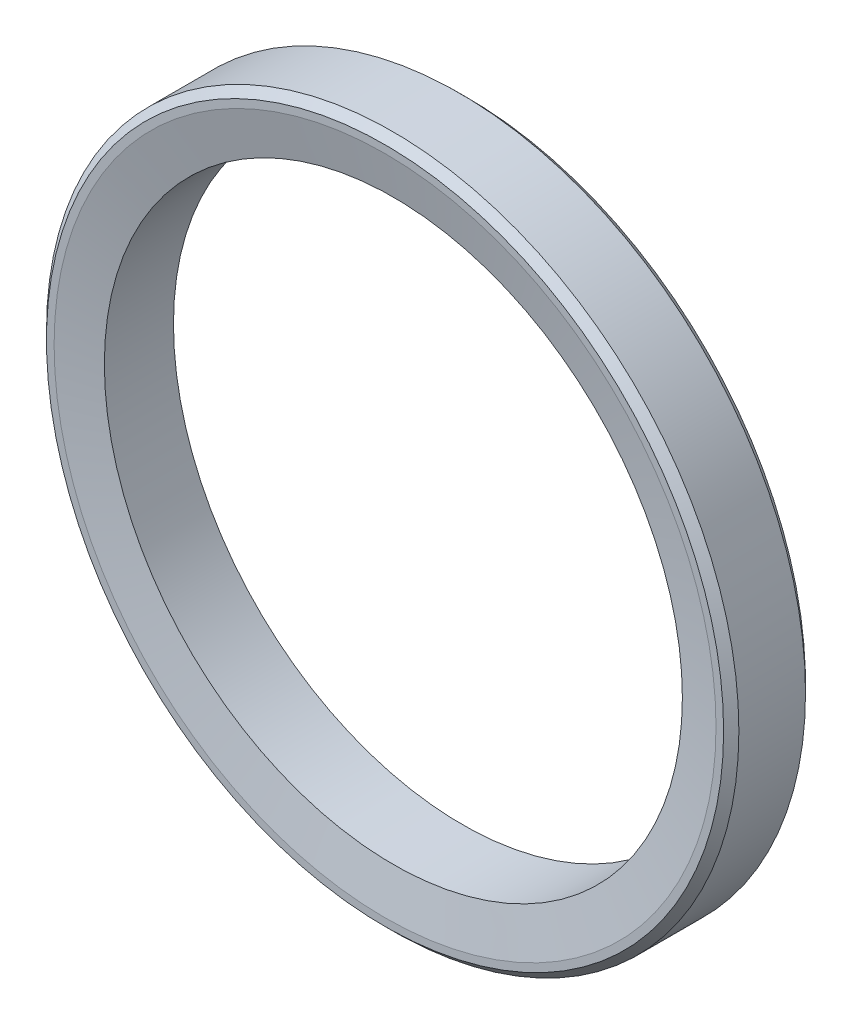
ISO-10303-21;
HEADER;
FILE_DESCRIPTION(('STEP AP214'),'2;1');
FILE_NAME('part.step','',(''),(''),'','','');
FILE_SCHEMA(('AUTOMOTIVE_DESIGN { 1 0 10303 214 1 1 1 1 }'));
ENDSEC;
DATA;
#1=APPLICATION_CONTEXT('core data for automotive mechanical design processes');
#2=APPLICATION_PROTOCOL_DEFINITION('international standard','automotive_design',2000,#1);
#3=PRODUCT_CONTEXT('',#1,'mechanical');
#4=PRODUCT('Part','Part','',(#3));
#5=PRODUCT_RELATED_PRODUCT_CATEGORY('part','',(#4));
#6=PRODUCT_DEFINITION_FORMATION('','',#4);
#7=PRODUCT_DEFINITION_CONTEXT('part definition',#1,'design');
#8=PRODUCT_DEFINITION('design','',#6,#7);
#9=PRODUCT_DEFINITION_SHAPE('','',#8);
#10=(LENGTH_UNIT() NAMED_UNIT(*) SI_UNIT(.MILLI.,.METRE.));
#11=(NAMED_UNIT(*) PLANE_ANGLE_UNIT() SI_UNIT($,.RADIAN.));
#12=(NAMED_UNIT(*) SI_UNIT($,.STERADIAN.) SOLID_ANGLE_UNIT());
#13=UNCERTAINTY_MEASURE_WITH_UNIT(LENGTH_MEASURE(1.E-05),#10,'distance_accuracy_value','');
#14=(GEOMETRIC_REPRESENTATION_CONTEXT(3) GLOBAL_UNCERTAINTY_ASSIGNED_CONTEXT((#13)) GLOBAL_UNIT_ASSIGNED_CONTEXT((#10,
#11,#12)) REPRESENTATION_CONTEXT('',''));
#15=CARTESIAN_POINT('',(0.,0.,0.));
#16=DIRECTION('',(0.,0.,1.));
#17=DIRECTION('',(1.,0.,0.));
#18=AXIS2_PLACEMENT_3D('',#15,#16,#17);
#19=CARTESIAN_POINT('',(0.,22.7,2.81047800082785));
#20=DIRECTION('',(0.,0.,1.));
#21=DIRECTION('',(1.,0.,0.));
#22=AXIS2_PLACEMENT_3D('',#19,#20,#21);
#23=PLANE('',#22);
#24=CARTESIAN_POINT('',(0.,0.,2.81047800082785));
#25=DIRECTION('',(0.,0.,1.));
#26=DIRECTION('',(1.,0.,0.));
#27=AXIS2_PLACEMENT_3D('',#24,#25,#26);
#28=CIRCLE('',#27,22.2);
#29=CARTESIAN_POINT('',(22.2,0.,2.81047800082785));
#30=VERTEX_POINT('',#29);
#31=EDGE_CURVE('E10',#30,#30,#28,.T.);
#32=ORIENTED_EDGE('',*,*,#31,.T.);
#33=EDGE_LOOP('',(#32));
#34=FACE_BOUND('',#33,.T.);
#35=CARTESIAN_POINT('',(0.,0.,2.81047800082785));
#36=DIRECTION('',(0.,0.,-1.));
#37=DIRECTION('',(-1.,0.,0.));
#38=AXIS2_PLACEMENT_3D('',#35,#36,#37);
#39=CIRCLE('',#38,21.7);
#40=CARTESIAN_POINT('',(-21.7,0.,2.81047800082785));
#41=VERTEX_POINT('',#40);
#42=EDGE_CURVE('E54',#41,#41,#39,.T.);
#43=ORIENTED_EDGE('',*,*,#42,.T.);
#44=EDGE_LOOP('',(#43));
#45=FACE_BOUND('',#44,.T.);
#46=ADVANCED_FACE('F34',(#34,#45),#23,.T.);
#47=CARTESIAN_POINT('',(0.,0.,2.81047800082785));
#48=DIRECTION('',(0.,0.,1.));
#49=DIRECTION('',(1.,0.,0.));
#50=AXIS2_PLACEMENT_3D('',#47,#48,#49);
#51=CONICAL_SURFACE('',#50,21.7,1.37514491764633);
#52=CARTESIAN_POINT('',(0.,0.,2.26546453743581));
#53=DIRECTION('',(0.,0.,-1.));
#54=DIRECTION('',(-1.,0.,0.));
#55=AXIS2_PLACEMENT_3D('',#52,#53,#54);
#56=CIRCLE('',#55,18.95);
#57=CARTESIAN_POINT('',(-18.95,0.,2.26546453743581));
#58=VERTEX_POINT('',#57);
#59=EDGE_CURVE('E59',#58,#58,#56,.T.);
#60=ORIENTED_EDGE('',*,*,#59,.T.);
#61=EDGE_LOOP('',(#60));
#62=FACE_BOUND('',#61,.T.);
#63=ORIENTED_EDGE('',*,*,#42,.F.);
#64=EDGE_LOOP('',(#63));
#65=FACE_BOUND('',#64,.T.);
#66=ADVANCED_FACE('F86',(#62,#65),#51,.F.);
#67=CARTESIAN_POINT('',(0.,0.,-1.40875866051392));
#68=DIRECTION('',(0.,0.,-1.));
#69=DIRECTION('',(-1.,0.,0.));
#70=AXIS2_PLACEMENT_3D('',#67,#68,#69);
#71=CYLINDRICAL_SURFACE('',#70,18.95);
#72=CARTESIAN_POINT('',(0.,0.,-2.26546453743581));
#73=DIRECTION('',(0.,0.,-1.));
#74=DIRECTION('',(-1.,0.,0.));
#75=AXIS2_PLACEMENT_3D('',#72,#73,#74);
#76=CIRCLE('',#75,18.95);
#77=CARTESIAN_POINT('',(-18.95,0.,-2.26546453743581));
#78=VERTEX_POINT('',#77);
#79=EDGE_CURVE('E63',#78,#78,#76,.T.);
#80=ORIENTED_EDGE('',*,*,#79,.T.);
#81=EDGE_LOOP('',(#80));
#82=FACE_BOUND('',#81,.T.);
#83=ORIENTED_EDGE('',*,*,#59,.F.);
#84=EDGE_LOOP('',(#83));
#85=FACE_BOUND('',#84,.T.);
#86=ADVANCED_FACE('F90',(#82,#85),#71,.F.);
#87=CARTESIAN_POINT('',(0.,0.,-2.26546453743581));
#88=DIRECTION('',(0.,0.,-1.));
#89=DIRECTION('',(-1.,0.,0.));
#90=AXIS2_PLACEMENT_3D('',#87,#88,#89);
#91=CONICAL_SURFACE('',#90,18.95,1.48056280446679);
#92=CARTESIAN_POINT('',(0.,0.,-2.55952199917215));
#93=DIRECTION('',(0.,0.,-1.));
#94=DIRECTION('',(-1.,0.,0.));
#95=AXIS2_PLACEMENT_3D('',#92,#93,#94);
#96=CIRCLE('',#95,22.2);
#97=CARTESIAN_POINT('',(-22.2,0.,-2.55952199917215));
#98=VERTEX_POINT('',#97);
#99=EDGE_CURVE('E67',#98,#98,#96,.T.);
#100=ORIENTED_EDGE('',*,*,#99,.T.);
#101=EDGE_LOOP('',(#100));
#102=FACE_BOUND('',#101,.T.);
#103=ORIENTED_EDGE('',*,*,#79,.F.);
#104=EDGE_LOOP('',(#103));
#105=FACE_BOUND('',#104,.T.);
#106=ADVANCED_FACE('F71',(#102,#105),#91,.F.);
#107=CARTESIAN_POINT('',(0.,0.,-1.40875866051392));
#108=DIRECTION('',(0.,0.,-1.));
#109=DIRECTION('',(-1.,0.,0.));
#110=AXIS2_PLACEMENT_3D('',#107,#108,#109);
#111=CYLINDRICAL_SURFACE('',#110,22.7);
#112=CARTESIAN_POINT('',(0.,0.,-2.05952199917214));
#113=DIRECTION('',(0.,0.,-1.));
#114=DIRECTION('',(-1.,0.,0.));
#115=AXIS2_PLACEMENT_3D('',#112,#113,#114);
#116=CIRCLE('',#115,22.7);
#117=CARTESIAN_POINT('',(-22.7,0.,-2.05952199917214));
#118=VERTEX_POINT('',#117);
#119=EDGE_CURVE('E42',#118,#118,#116,.F.);
#120=ORIENTED_EDGE('',*,*,#119,.T.);
#121=EDGE_LOOP('',(#120));
#122=FACE_BOUND('',#121,.T.);
#123=CARTESIAN_POINT('',(0.,0.,2.31047800082786));
#124=DIRECTION('',(0.,0.,1.));
#125=DIRECTION('',(1.,0.,0.));
#126=AXIS2_PLACEMENT_3D('',#123,#124,#125);
#127=CIRCLE('',#126,22.7);
#128=CARTESIAN_POINT('',(22.7,0.,2.31047800082786));
#129=VERTEX_POINT('',#128);
#130=EDGE_CURVE('E49',#129,#129,#127,.F.);
#131=ORIENTED_EDGE('',*,*,#130,.T.);
#132=EDGE_LOOP('',(#131));
#133=FACE_BOUND('',#132,.T.);
#134=ADVANCED_FACE('F76',(#122,#133),#111,.T.);
#135=CARTESIAN_POINT('',(0.,0.,-2.55952199917215));
#136=DIRECTION('',(0.,0.,1.));
#137=DIRECTION('',(1.,0.,0.));
#138=AXIS2_PLACEMENT_3D('',#135,#136,#137);
#139=CONICAL_SURFACE('',#138,22.2,0.785398163397441);
#140=ORIENTED_EDGE('',*,*,#119,.F.);
#141=EDGE_LOOP('',(#140));
#142=FACE_BOUND('',#141,.T.);
#143=ORIENTED_EDGE('',*,*,#99,.F.);
#144=EDGE_LOOP('',(#143));
#145=FACE_BOUND('',#144,.T.);
#146=ADVANCED_FACE('F74',(#142,#145),#139,.T.);
#147=CARTESIAN_POINT('',(0.,0.,2.31047800082786));
#148=DIRECTION('',(0.,0.,-1.));
#149=DIRECTION('',(-1.,0.,0.));
#150=AXIS2_PLACEMENT_3D('',#147,#148,#149);
#151=CONICAL_SURFACE('',#150,22.7,0.785398163397452);
#152=ORIENTED_EDGE('',*,*,#31,.F.);
#153=EDGE_LOOP('',(#152));
#154=FACE_BOUND('',#153,.T.);
#155=ORIENTED_EDGE('',*,*,#130,.F.);
#156=EDGE_LOOP('',(#155));
#157=FACE_BOUND('',#156,.T.);
#158=ADVANCED_FACE('F36',(#154,#157),#151,.T.);
#159=CLOSED_SHELL('',(#46,#66,#86,#106,#134,#146,#158));
#160=MANIFOLD_SOLID_BREP('B2',#159);
#161=ADVANCED_BREP_SHAPE_REPRESENTATION('',(#18,#160),#14);
#162=SHAPE_DEFINITION_REPRESENTATION(#9,#161);
ENDSEC;
END-ISO-10303-21;
